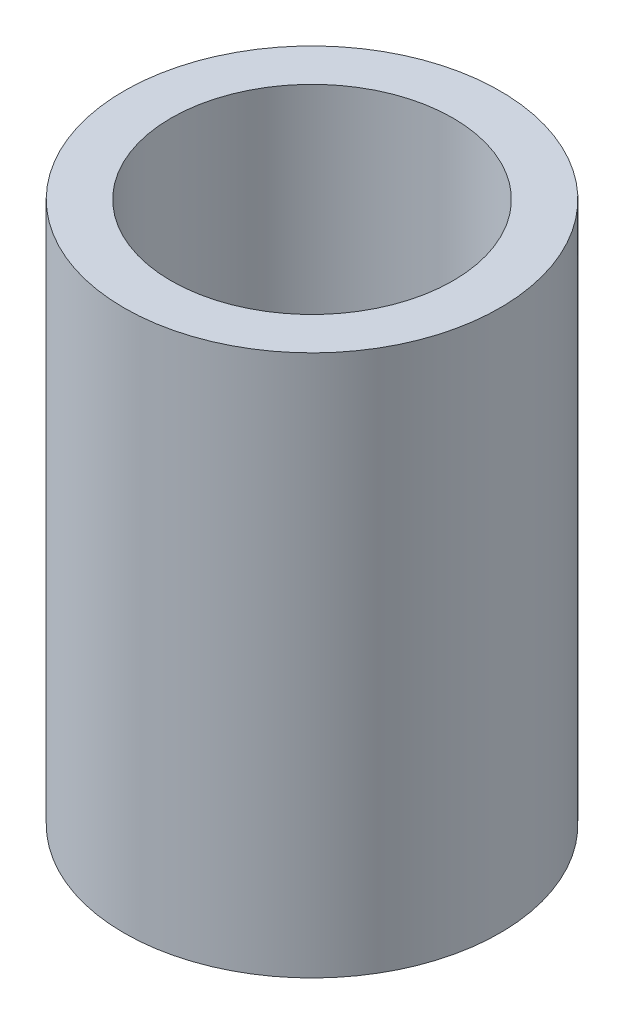
ISO-10303-21;
HEADER;
FILE_DESCRIPTION(('STEP AP214'),'2;1');
FILE_NAME('part.step','',(''),(''),'','','');
FILE_SCHEMA(('AUTOMOTIVE_DESIGN { 1 0 10303 214 1 1 1 1 }'));
ENDSEC;
DATA;
#1=APPLICATION_CONTEXT('core data for automotive mechanical design processes');
#2=APPLICATION_PROTOCOL_DEFINITION('international standard','automotive_design',2000,#1);
#3=PRODUCT_CONTEXT('',#1,'mechanical');
#4=PRODUCT('Part','Part','',(#3));
#5=PRODUCT_RELATED_PRODUCT_CATEGORY('part','',(#4));
#6=PRODUCT_DEFINITION_FORMATION('','',#4);
#7=PRODUCT_DEFINITION_CONTEXT('part definition',#1,'design');
#8=PRODUCT_DEFINITION('design','',#6,#7);
#9=PRODUCT_DEFINITION_SHAPE('','',#8);
#10=(LENGTH_UNIT() NAMED_UNIT(*) SI_UNIT(.MILLI.,.METRE.));
#11=(NAMED_UNIT(*) PLANE_ANGLE_UNIT() SI_UNIT($,.RADIAN.));
#12=(NAMED_UNIT(*) SI_UNIT($,.STERADIAN.) SOLID_ANGLE_UNIT());
#13=UNCERTAINTY_MEASURE_WITH_UNIT(LENGTH_MEASURE(1.E-05),#10,'distance_accuracy_value','');
#14=(GEOMETRIC_REPRESENTATION_CONTEXT(3) GLOBAL_UNCERTAINTY_ASSIGNED_CONTEXT((#13)) GLOBAL_UNIT_ASSIGNED_CONTEXT((#10,
#11,#12)) REPRESENTATION_CONTEXT('',''));
#15=CARTESIAN_POINT('',(0.,0.,0.));
#16=DIRECTION('',(0.,0.,1.));
#17=DIRECTION('',(1.,0.,0.));
#18=AXIS2_PLACEMENT_3D('',#15,#16,#17);
#19=CARTESIAN_POINT('',(0.,28.8,0.));
#20=DIRECTION('',(0.,1.,0.));
#21=DIRECTION('',(0.,0.,1.));
#22=AXIS2_PLACEMENT_3D('',#19,#20,#21);
#23=PLANE('',#22);
#24=CARTESIAN_POINT('',(0.,28.8,0.));
#25=DIRECTION('',(0.,1.,0.));
#26=DIRECTION('',(0.,0.,1.));
#27=AXIS2_PLACEMENT_3D('',#24,#25,#26);
#28=CIRCLE('',#27,10.);
#29=CARTESIAN_POINT('',(0.,28.8,10.));
#30=VERTEX_POINT('',#29);
#31=EDGE_CURVE('E10',#30,#30,#28,.T.);
#32=ORIENTED_EDGE('',*,*,#31,.T.);
#33=EDGE_LOOP('',(#32));
#34=FACE_BOUND('',#33,.T.);
#35=CARTESIAN_POINT('',(0.,28.8,0.));
#36=DIRECTION('',(0.,1.,0.));
#37=DIRECTION('',(0.,0.,1.));
#38=AXIS2_PLACEMENT_3D('',#35,#36,#37);
#39=CIRCLE('',#38,7.5);
#40=CARTESIAN_POINT('',(0.,28.8,7.5));
#41=VERTEX_POINT('',#40);
#42=EDGE_CURVE('E41',#41,#41,#39,.T.);
#43=ORIENTED_EDGE('',*,*,#42,.F.);
#44=EDGE_LOOP('',(#43));
#45=FACE_BOUND('',#44,.T.);
#46=ADVANCED_FACE('F30',(#34,#45),#23,.T.);
#47=CARTESIAN_POINT('',(0.,0.,0.));
#48=DIRECTION('',(0.,1.,0.));
#49=DIRECTION('',(0.,0.,1.));
#50=AXIS2_PLACEMENT_3D('',#47,#48,#49);
#51=PLANE('',#50);
#52=CARTESIAN_POINT('',(0.,0.,0.));
#53=DIRECTION('',(0.,1.,0.));
#54=DIRECTION('',(0.,0.,1.));
#55=AXIS2_PLACEMENT_3D('',#52,#53,#54);
#56=CIRCLE('',#55,10.);
#57=CARTESIAN_POINT('',(0.,0.,10.));
#58=VERTEX_POINT('',#57);
#59=EDGE_CURVE('E34',#58,#58,#56,.T.);
#60=ORIENTED_EDGE('',*,*,#59,.F.);
#61=EDGE_LOOP('',(#60));
#62=FACE_BOUND('',#61,.T.);
#63=CARTESIAN_POINT('',(0.,0.,0.));
#64=DIRECTION('',(0.,1.,0.));
#65=DIRECTION('',(0.,0.,1.));
#66=AXIS2_PLACEMENT_3D('',#63,#64,#65);
#67=CIRCLE('',#66,7.5);
#68=CARTESIAN_POINT('',(0.,0.,7.5));
#69=VERTEX_POINT('',#68);
#70=EDGE_CURVE('E43',#69,#69,#67,.T.);
#71=ORIENTED_EDGE('',*,*,#70,.T.);
#72=EDGE_LOOP('',(#71));
#73=FACE_BOUND('',#72,.T.);
#74=ADVANCED_FACE('F53',(#62,#73),#51,.F.);
#75=CARTESIAN_POINT('',(0.,28.8,0.));
#76=DIRECTION('',(0.,-1.,0.));
#77=DIRECTION('',(0.,0.,-1.));
#78=AXIS2_PLACEMENT_3D('',#75,#76,#77);
#79=CYLINDRICAL_SURFACE('',#78,10.);
#80=ORIENTED_EDGE('',*,*,#31,.F.);
#81=EDGE_LOOP('',(#80));
#82=FACE_BOUND('',#81,.T.);
#83=ORIENTED_EDGE('',*,*,#59,.T.);
#84=EDGE_LOOP('',(#83));
#85=FACE_BOUND('',#84,.T.);
#86=ADVANCED_FACE('F32',(#82,#85),#79,.T.);
#87=CARTESIAN_POINT('',(0.,28.8,0.));
#88=DIRECTION('',(0.,-1.,0.));
#89=DIRECTION('',(0.,0.,-1.));
#90=AXIS2_PLACEMENT_3D('',#87,#88,#89);
#91=CYLINDRICAL_SURFACE('',#90,7.5);
#92=ORIENTED_EDGE('',*,*,#42,.T.);
#93=EDGE_LOOP('',(#92));
#94=FACE_BOUND('',#93,.T.);
#95=ORIENTED_EDGE('',*,*,#70,.F.);
#96=EDGE_LOOP('',(#95));
#97=FACE_BOUND('',#96,.T.);
#98=ADVANCED_FACE('F49',(#94,#97),#91,.F.);
#99=CLOSED_SHELL('',(#46,#74,#86,#98));
#100=MANIFOLD_SOLID_BREP('B2',#99);
#101=ADVANCED_BREP_SHAPE_REPRESENTATION('',(#18,#100),#14);
#102=SHAPE_DEFINITION_REPRESENTATION(#9,#101);
ENDSEC;
END-ISO-10303-21;
